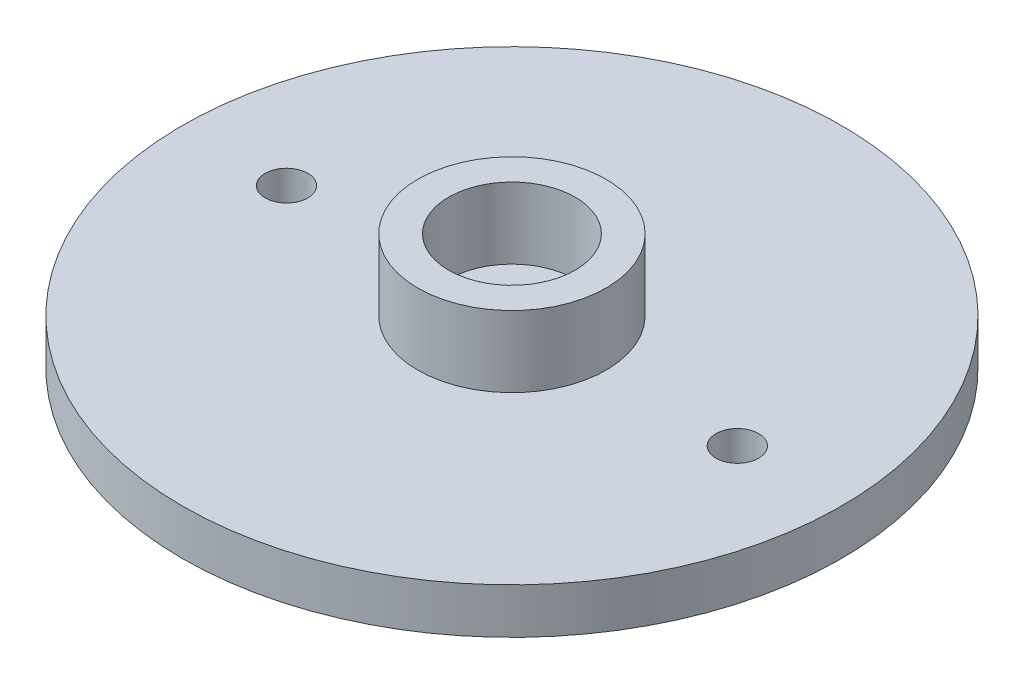
ISO-10303-21;
HEADER;
FILE_DESCRIPTION(('STEP AP214'),'2;1');
FILE_NAME('part.step','',(''),(''),'','','');
FILE_SCHEMA(('AUTOMOTIVE_DESIGN { 1 0 10303 214 1 1 1 1 }'));
ENDSEC;
DATA;
#1=APPLICATION_CONTEXT('core data for automotive mechanical design processes');
#2=APPLICATION_PROTOCOL_DEFINITION('international standard','automotive_design',2000,#1);
#3=PRODUCT_CONTEXT('',#1,'mechanical');
#4=PRODUCT('Part','Part','',(#3));
#5=PRODUCT_RELATED_PRODUCT_CATEGORY('part','',(#4));
#6=PRODUCT_DEFINITION_FORMATION('','',#4);
#7=PRODUCT_DEFINITION_CONTEXT('part definition',#1,'design');
#8=PRODUCT_DEFINITION('design','',#6,#7);
#9=PRODUCT_DEFINITION_SHAPE('','',#8);
#10=(LENGTH_UNIT() NAMED_UNIT(*) SI_UNIT(.MILLI.,.METRE.));
#11=(NAMED_UNIT(*) PLANE_ANGLE_UNIT() SI_UNIT($,.RADIAN.));
#12=(NAMED_UNIT(*) SI_UNIT($,.STERADIAN.) SOLID_ANGLE_UNIT());
#13=UNCERTAINTY_MEASURE_WITH_UNIT(LENGTH_MEASURE(1.E-05),#10,'distance_accuracy_value','');
#14=(GEOMETRIC_REPRESENTATION_CONTEXT(3) GLOBAL_UNCERTAINTY_ASSIGNED_CONTEXT((#13)) GLOBAL_UNIT_ASSIGNED_CONTEXT((#10,
#11,#12)) REPRESENTATION_CONTEXT('',''));
#15=CARTESIAN_POINT('',(0.,0.,0.));
#16=DIRECTION('',(0.,0.,1.));
#17=DIRECTION('',(1.,0.,0.));
#18=AXIS2_PLACEMENT_3D('',#15,#16,#17);
#19=CARTESIAN_POINT('',(0.,1.6256,0.));
#20=DIRECTION('',(0.,-1.,0.));
#21=DIRECTION('',(0.,0.,-1.));
#22=AXIS2_PLACEMENT_3D('',#19,#20,#21);
#23=CYLINDRICAL_SURFACE('',#22,1.016);
#24=CARTESIAN_POINT('',(0.,1.6256,0.));
#25=DIRECTION('',(0.,1.,0.));
#26=DIRECTION('',(0.,0.,1.));
#27=AXIS2_PLACEMENT_3D('',#24,#25,#26);
#28=CIRCLE('',#27,1.016);
#29=CARTESIAN_POINT('',(0.,1.6256,1.016));
#30=VERTEX_POINT('',#29);
#31=EDGE_CURVE('E48',#30,#30,#28,.T.);
#32=ORIENTED_EDGE('',*,*,#31,.T.);
#33=EDGE_LOOP('',(#32));
#34=FACE_BOUND('',#33,.T.);
#35=CARTESIAN_POINT('',(0.,0.4064,0.));
#36=DIRECTION('',(0.,-1.,0.));
#37=DIRECTION('',(0.,0.,-1.));
#38=AXIS2_PLACEMENT_3D('',#35,#36,#37);
#39=CIRCLE('',#38,1.016);
#40=CARTESIAN_POINT('',(0.,0.4064,-1.016));
#41=VERTEX_POINT('',#40);
#42=EDGE_CURVE('E34',#41,#41,#39,.T.);
#43=ORIENTED_EDGE('',*,*,#42,.T.);
#44=EDGE_LOOP('',(#43));
#45=FACE_BOUND('',#44,.T.);
#46=ADVANCED_FACE('F30',(#34,#45),#23,.F.);
#47=CARTESIAN_POINT('',(0.,1.6256,0.));
#48=DIRECTION('',(0.,1.,0.));
#49=DIRECTION('',(0.,0.,1.));
#50=AXIS2_PLACEMENT_3D('',#47,#48,#49);
#51=PLANE('',#50);
#52=ORIENTED_EDGE('',*,*,#31,.F.);
#53=EDGE_LOOP('',(#52));
#54=FACE_BOUND('',#53,.T.);
#55=CARTESIAN_POINT('',(0.,1.6256,0.));
#56=DIRECTION('',(0.,1.,0.));
#57=DIRECTION('',(0.,0.,1.));
#58=AXIS2_PLACEMENT_3D('',#55,#56,#57);
#59=CIRCLE('',#58,2.2606);
#60=CARTESIAN_POINT('',(0.,1.6256,2.2606));
#61=VERTEX_POINT('',#60);
#62=EDGE_CURVE('E38',#61,#61,#59,.F.);
#63=ORIENTED_EDGE('',*,*,#62,.F.);
#64=EDGE_LOOP('',(#63));
#65=FACE_BOUND('',#64,.T.);
#66=ADVANCED_FACE('F99',(#54,#65),#51,.T.);
#67=CARTESIAN_POINT('',(0.,1.6256,0.));
#68=DIRECTION('',(0.,1.,0.));
#69=DIRECTION('',(0.,0.,1.));
#70=AXIS2_PLACEMENT_3D('',#67,#68,#69);
#71=CIRCLE('',#70,3.3655);
#72=CARTESIAN_POINT('',(0.,1.6256,3.3655));
#73=VERTEX_POINT('',#72);
#74=EDGE_CURVE('E66',#73,#73,#71,.T.);
#75=ORIENTED_EDGE('',*,*,#74,.F.);
#76=EDGE_LOOP('',(#75));
#77=FACE_BOUND('',#76,.T.);
#78=CARTESIAN_POINT('',(8.0518,1.6256,0.));
#79=DIRECTION('',(0.,1.,0.));
#80=DIRECTION('',(0.,0.,1.));
#81=AXIS2_PLACEMENT_3D('',#78,#79,#80);
#82=CIRCLE('',#81,0.762000000000001);
#83=CARTESIAN_POINT('',(8.0518,1.6256,0.762000000000001));
#84=VERTEX_POINT('',#83);
#85=EDGE_CURVE('E61',#84,#84,#82,.T.);
#86=ORIENTED_EDGE('',*,*,#85,.F.);
#87=EDGE_LOOP('',(#86));
#88=FACE_BOUND('',#87,.T.);
#89=CARTESIAN_POINT('',(-8.0518,1.6256,0.));
#90=DIRECTION('',(0.,1.,0.));
#91=DIRECTION('',(0.,0.,1.));
#92=AXIS2_PLACEMENT_3D('',#89,#90,#91);
#93=CIRCLE('',#92,0.761999999999999);
#94=CARTESIAN_POINT('',(-8.0518,1.6256,0.761999999999999));
#95=VERTEX_POINT('',#94);
#96=EDGE_CURVE('E54',#95,#95,#93,.T.);
#97=ORIENTED_EDGE('',*,*,#96,.F.);
#98=EDGE_LOOP('',(#97));
#99=FACE_BOUND('',#98,.T.);
#100=CARTESIAN_POINT('',(0.,1.6256,0.));
#101=DIRECTION('',(0.,1.,0.));
#102=DIRECTION('',(0.,0.,1.));
#103=AXIS2_PLACEMENT_3D('',#100,#101,#102);
#104=CIRCLE('',#103,11.7729);
#105=CARTESIAN_POINT('',(0.,1.6256,11.7729));
#106=VERTEX_POINT('',#105);
#107=EDGE_CURVE('E42',#106,#106,#104,.T.);
#108=ORIENTED_EDGE('',*,*,#107,.T.);
#109=EDGE_LOOP('',(#108));
#110=FACE_BOUND('',#109,.T.);
#111=ADVANCED_FACE('F105',(#77,#88,#99,#110),#51,.T.);
#112=CARTESIAN_POINT('',(0.,0.,0.));
#113=DIRECTION('',(0.,1.,0.));
#114=DIRECTION('',(0.,0.,1.));
#115=AXIS2_PLACEMENT_3D('',#112,#113,#114);
#116=PLANE('',#115);
#117=CARTESIAN_POINT('',(0.,0.,0.));
#118=DIRECTION('',(0.,1.,0.));
#119=DIRECTION('',(0.,0.,1.));
#120=AXIS2_PLACEMENT_3D('',#117,#118,#119);
#121=CIRCLE('',#120,2.6924);
#122=CARTESIAN_POINT('',(0.,0.,2.6924));
#123=VERTEX_POINT('',#122);
#124=EDGE_CURVE('E10',#123,#123,#121,.F.);
#125=ORIENTED_EDGE('',*,*,#124,.F.);
#126=EDGE_LOOP('',(#125));
#127=FACE_BOUND('',#126,.T.);
#128=CARTESIAN_POINT('',(8.0518,0.,0.));
#129=DIRECTION('',(0.,1.,0.));
#130=DIRECTION('',(0.,0.,1.));
#131=AXIS2_PLACEMENT_3D('',#128,#129,#130);
#132=CIRCLE('',#131,0.762000000000001);
#133=CARTESIAN_POINT('',(8.0518,0.,0.762000000000001));
#134=VERTEX_POINT('',#133);
#135=EDGE_CURVE('E53',#134,#134,#132,.T.);
#136=ORIENTED_EDGE('',*,*,#135,.T.);
#137=EDGE_LOOP('',(#136));
#138=FACE_BOUND('',#137,.T.);
#139=CARTESIAN_POINT('',(-8.0518,0.,0.));
#140=DIRECTION('',(0.,1.,0.));
#141=DIRECTION('',(0.,0.,1.));
#142=AXIS2_PLACEMENT_3D('',#139,#140,#141);
#143=CIRCLE('',#142,0.761999999999999);
#144=CARTESIAN_POINT('',(-8.0518,0.,0.761999999999999));
#145=VERTEX_POINT('',#144);
#146=EDGE_CURVE('E57',#145,#145,#143,.T.);
#147=ORIENTED_EDGE('',*,*,#146,.T.);
#148=EDGE_LOOP('',(#147));
#149=FACE_BOUND('',#148,.T.);
#150=CARTESIAN_POINT('',(0.,0.,0.));
#151=DIRECTION('',(0.,1.,0.));
#152=DIRECTION('',(0.,0.,1.));
#153=AXIS2_PLACEMENT_3D('',#150,#151,#152);
#154=CIRCLE('',#153,11.7729);
#155=CARTESIAN_POINT('',(0.,0.,11.7729));
#156=VERTEX_POINT('',#155);
#157=EDGE_CURVE('E45',#156,#156,#154,.T.);
#158=ORIENTED_EDGE('',*,*,#157,.F.);
#159=EDGE_LOOP('',(#158));
#160=FACE_BOUND('',#159,.T.);
#161=ADVANCED_FACE('F112',(#127,#138,#149,#160),#116,.F.);
#162=CARTESIAN_POINT('',(0.,1.6256,0.));
#163=DIRECTION('',(0.,-1.,0.));
#164=DIRECTION('',(0.,0.,-1.));
#165=AXIS2_PLACEMENT_3D('',#162,#163,#164);
#166=CYLINDRICAL_SURFACE('',#165,11.7729);
#167=ORIENTED_EDGE('',*,*,#107,.F.);
#168=EDGE_LOOP('',(#167));
#169=FACE_BOUND('',#168,.T.);
#170=ORIENTED_EDGE('',*,*,#157,.T.);
#171=EDGE_LOOP('',(#170));
#172=FACE_BOUND('',#171,.T.);
#173=ADVANCED_FACE('F32',(#169,#172),#166,.T.);
#174=CARTESIAN_POINT('',(-8.0518,0.,0.));
#175=DIRECTION('',(0.,1.,0.));
#176=DIRECTION('',(0.,0.,1.));
#177=AXIS2_PLACEMENT_3D('',#174,#175,#176);
#178=CYLINDRICAL_SURFACE('',#177,0.761999999999999);
#179=ORIENTED_EDGE('',*,*,#146,.F.);
#180=EDGE_LOOP('',(#179));
#181=FACE_BOUND('',#180,.T.);
#182=ORIENTED_EDGE('',*,*,#96,.T.);
#183=EDGE_LOOP('',(#182));
#184=FACE_BOUND('',#183,.T.);
#185=ADVANCED_FACE('F109',(#181,#184),#178,.F.);
#186=CARTESIAN_POINT('',(8.0518,0.,0.));
#187=DIRECTION('',(0.,1.,0.));
#188=DIRECTION('',(0.,0.,1.));
#189=AXIS2_PLACEMENT_3D('',#186,#187,#188);
#190=CYLINDRICAL_SURFACE('',#189,0.762000000000001);
#191=ORIENTED_EDGE('',*,*,#135,.F.);
#192=EDGE_LOOP('',(#191));
#193=FACE_BOUND('',#192,.T.);
#194=ORIENTED_EDGE('',*,*,#85,.T.);
#195=EDGE_LOOP('',(#194));
#196=FACE_BOUND('',#195,.T.);
#197=ADVANCED_FACE('F130',(#193,#196),#190,.F.);
#198=CARTESIAN_POINT('',(0.,4.1656,0.));
#199=DIRECTION('',(0.,1.,0.));
#200=DIRECTION('',(0.,0.,1.));
#201=AXIS2_PLACEMENT_3D('',#198,#199,#200);
#202=PLANE('',#201);
#203=CARTESIAN_POINT('',(0.,4.1656,0.));
#204=DIRECTION('',(0.,1.,0.));
#205=DIRECTION('',(0.,0.,1.));
#206=AXIS2_PLACEMENT_3D('',#203,#204,#205);
#207=CIRCLE('',#206,3.3655);
#208=CARTESIAN_POINT('',(0.,4.1656,3.3655));
#209=VERTEX_POINT('',#208);
#210=EDGE_CURVE('E58',#209,#209,#207,.T.);
#211=ORIENTED_EDGE('',*,*,#210,.T.);
#212=EDGE_LOOP('',(#211));
#213=FACE_BOUND('',#212,.T.);
#214=CARTESIAN_POINT('',(0.,4.1656,0.));
#215=DIRECTION('',(0.,1.,0.));
#216=DIRECTION('',(0.,0.,1.));
#217=AXIS2_PLACEMENT_3D('',#214,#215,#216);
#218=CIRCLE('',#217,2.2606);
#219=CARTESIAN_POINT('',(0.,4.1656,2.2606));
#220=VERTEX_POINT('',#219);
#221=EDGE_CURVE('E69',#220,#220,#218,.T.);
#222=ORIENTED_EDGE('',*,*,#221,.F.);
#223=EDGE_LOOP('',(#222));
#224=FACE_BOUND('',#223,.T.);
#225=ADVANCED_FACE('F138',(#213,#224),#202,.T.);
#226=CARTESIAN_POINT('',(0.,4.1656,0.));
#227=DIRECTION('',(0.,-1.,0.));
#228=DIRECTION('',(0.,0.,-1.));
#229=AXIS2_PLACEMENT_3D('',#226,#227,#228);
#230=CYLINDRICAL_SURFACE('',#229,3.3655);
#231=ORIENTED_EDGE('',*,*,#210,.F.);
#232=EDGE_LOOP('',(#231));
#233=FACE_BOUND('',#232,.T.);
#234=ORIENTED_EDGE('',*,*,#74,.T.);
#235=EDGE_LOOP('',(#234));
#236=FACE_BOUND('',#235,.T.);
#237=ADVANCED_FACE('F143',(#233,#236),#230,.T.);
#238=CARTESIAN_POINT('',(0.,4.1656,0.));
#239=DIRECTION('',(0.,-1.,0.));
#240=DIRECTION('',(0.,0.,-1.));
#241=AXIS2_PLACEMENT_3D('',#238,#239,#240);
#242=CYLINDRICAL_SURFACE('',#241,2.2606);
#243=ORIENTED_EDGE('',*,*,#221,.T.);
#244=EDGE_LOOP('',(#243));
#245=FACE_BOUND('',#244,.T.);
#246=ORIENTED_EDGE('',*,*,#62,.T.);
#247=EDGE_LOOP('',(#246));
#248=FACE_BOUND('',#247,.T.);
#249=ADVANCED_FACE('F149',(#245,#248),#242,.F.);
#250=CARTESIAN_POINT('',(0.,-0.8636,0.));
#251=DIRECTION('',(0.,1.,0.));
#252=DIRECTION('',(0.,0.,1.));
#253=AXIS2_PLACEMENT_3D('',#250,#251,#252);
#254=CYLINDRICAL_SURFACE('',#253,2.6924);
#255=CARTESIAN_POINT('',(0.,-0.8636,0.));
#256=DIRECTION('',(0.,-1.,0.));
#257=DIRECTION('',(0.,0.,-1.));
#258=AXIS2_PLACEMENT_3D('',#255,#256,#257);
#259=CIRCLE('',#258,2.6924);
#260=CARTESIAN_POINT('',(0.,-0.8636,-2.6924));
#261=VERTEX_POINT('',#260);
#262=EDGE_CURVE('E74',#261,#261,#259,.T.);
#263=ORIENTED_EDGE('',*,*,#262,.F.);
#264=EDGE_LOOP('',(#263));
#265=FACE_BOUND('',#264,.T.);
#266=ORIENTED_EDGE('',*,*,#124,.T.);
#267=EDGE_LOOP('',(#266));
#268=FACE_BOUND('',#267,.T.);
#269=ADVANCED_FACE('F154',(#265,#268),#254,.T.);
#270=CARTESIAN_POINT('',(0.,-0.8636,0.));
#271=DIRECTION('',(0.,-1.,0.));
#272=DIRECTION('',(0.,0.,-1.));
#273=AXIS2_PLACEMENT_3D('',#270,#271,#272);
#274=PLANE('',#273);
#275=CARTESIAN_POINT('',(0.,-0.8636,0.));
#276=DIRECTION('',(0.,-1.,0.));
#277=DIRECTION('',(0.,0.,-1.));
#278=AXIS2_PLACEMENT_3D('',#275,#276,#277);
#279=CIRCLE('',#278,2.2606);
#280=CARTESIAN_POINT('',(0.,-0.8636,-2.2606));
#281=VERTEX_POINT('',#280);
#282=EDGE_CURVE('E77',#281,#281,#279,.T.);
#283=ORIENTED_EDGE('',*,*,#282,.F.);
#284=EDGE_LOOP('',(#283));
#285=FACE_BOUND('',#284,.T.);
#286=ORIENTED_EDGE('',*,*,#262,.T.);
#287=EDGE_LOOP('',(#286));
#288=FACE_BOUND('',#287,.T.);
#289=ADVANCED_FACE('F95',(#285,#288),#274,.T.);
#290=CARTESIAN_POINT('',(0.,0.4064,0.));
#291=DIRECTION('',(0.,-1.,0.));
#292=DIRECTION('',(0.,0.,-1.));
#293=AXIS2_PLACEMENT_3D('',#290,#291,#292);
#294=CYLINDRICAL_SURFACE('',#293,2.2606);
#295=CARTESIAN_POINT('',(0.,0.4064,0.));
#296=DIRECTION('',(0.,-1.,0.));
#297=DIRECTION('',(0.,0.,-1.));
#298=AXIS2_PLACEMENT_3D('',#295,#296,#297);
#299=CIRCLE('',#298,2.2606);
#300=CARTESIAN_POINT('',(0.,0.4064,-2.2606));
#301=VERTEX_POINT('',#300);
#302=EDGE_CURVE('E80',#301,#301,#299,.T.);
#303=ORIENTED_EDGE('',*,*,#302,.F.);
#304=EDGE_LOOP('',(#303));
#305=FACE_BOUND('',#304,.T.);
#306=ORIENTED_EDGE('',*,*,#282,.T.);
#307=EDGE_LOOP('',(#306));
#308=FACE_BOUND('',#307,.T.);
#309=ADVANCED_FACE('F90',(#305,#308),#294,.F.);
#310=CARTESIAN_POINT('',(0.,0.4064,0.));
#311=DIRECTION('',(0.,-1.,0.));
#312=DIRECTION('',(0.,0.,-1.));
#313=AXIS2_PLACEMENT_3D('',#310,#311,#312);
#314=PLANE('',#313);
#315=ORIENTED_EDGE('',*,*,#42,.F.);
#316=EDGE_LOOP('',(#315));
#317=FACE_BOUND('',#316,.T.);
#318=ORIENTED_EDGE('',*,*,#302,.T.);
#319=EDGE_LOOP('',(#318));
#320=FACE_BOUND('',#319,.T.);
#321=ADVANCED_FACE('F88',(#317,#320),#314,.T.);
#322=CLOSED_SHELL('',(#46,#66,#111,#161,#173,#185,#197,#225,#237,#249,#269,#289,#309,#321));
#323=MANIFOLD_SOLID_BREP('B2',#322);
#324=ADVANCED_BREP_SHAPE_REPRESENTATION('',(#18,#323),#14);
#325=SHAPE_DEFINITION_REPRESENTATION(#9,#324);
ENDSEC;
END-ISO-10303-21;
